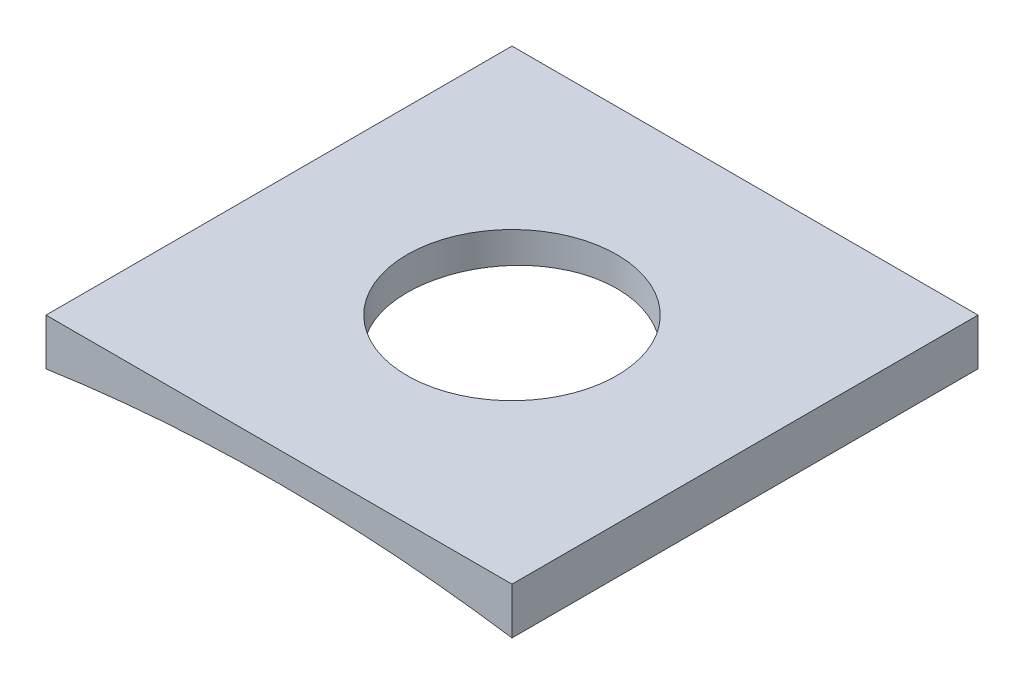
ISO-10303-21;
HEADER;
FILE_DESCRIPTION(('STEP AP214'),'2;1');
FILE_NAME('part.step','',(''),(''),'','','');
FILE_SCHEMA(('AUTOMOTIVE_DESIGN { 1 0 10303 214 1 1 1 1 }'));
ENDSEC;
DATA;
#1=APPLICATION_CONTEXT('core data for automotive mechanical design processes');
#2=APPLICATION_PROTOCOL_DEFINITION('international standard','automotive_design',2000,#1);
#3=PRODUCT_CONTEXT('',#1,'mechanical');
#4=PRODUCT('Part','Part','',(#3));
#5=PRODUCT_RELATED_PRODUCT_CATEGORY('part','',(#4));
#6=PRODUCT_DEFINITION_FORMATION('','',#4);
#7=PRODUCT_DEFINITION_CONTEXT('part definition',#1,'design');
#8=PRODUCT_DEFINITION('design','',#6,#7);
#9=PRODUCT_DEFINITION_SHAPE('','',#8);
#10=(LENGTH_UNIT() NAMED_UNIT(*) SI_UNIT(.MILLI.,.METRE.));
#11=(NAMED_UNIT(*) PLANE_ANGLE_UNIT() SI_UNIT($,.RADIAN.));
#12=(NAMED_UNIT(*) SI_UNIT($,.STERADIAN.) SOLID_ANGLE_UNIT());
#13=UNCERTAINTY_MEASURE_WITH_UNIT(LENGTH_MEASURE(1.E-05),#10,'distance_accuracy_value','');
#14=(GEOMETRIC_REPRESENTATION_CONTEXT(3) GLOBAL_UNCERTAINTY_ASSIGNED_CONTEXT((#13)) GLOBAL_UNIT_ASSIGNED_CONTEXT((#10,
#11,#12)) REPRESENTATION_CONTEXT('',''));
#15=CARTESIAN_POINT('',(0.,0.,0.));
#16=DIRECTION('',(0.,0.,1.));
#17=DIRECTION('',(1.,0.,0.));
#18=AXIS2_PLACEMENT_3D('',#15,#16,#17);
#19=CARTESIAN_POINT('',(-5.,0.,5.));
#20=DIRECTION('',(1.,0.,0.));
#21=DIRECTION('',(0.,0.,-1.));
#22=AXIS2_PLACEMENT_3D('',#19,#20,#21);
#23=PLANE('',#22);
#24=DIRECTION('',(0.,-1.,0.));
#25=VECTOR('',#24,1.);
#26=CARTESIAN_POINT('',(-5.,0.,-5.));
#27=LINE('',#26,#25);
#28=CARTESIAN_POINT('',(-5.,0.,-5.));
#29=VERTEX_POINT('',#28);
#30=CARTESIAN_POINT('',(-5.,-1.,-5.));
#31=VERTEX_POINT('',#30);
#32=EDGE_CURVE('E102',#29,#31,#27,.T.);
#33=ORIENTED_EDGE('',*,*,#32,.T.);
#34=DIRECTION('',(0.,0.,-1.));
#35=VECTOR('',#34,1.);
#36=CARTESIAN_POINT('',(-5.,-1.,5.));
#37=LINE('',#36,#35);
#38=CARTESIAN_POINT('',(-5.,-1.,5.));
#39=VERTEX_POINT('',#38);
#40=EDGE_CURVE('E11',#39,#31,#37,.T.);
#41=ORIENTED_EDGE('',*,*,#40,.F.);
#42=DIRECTION('',(0.,-1.,0.));
#43=VECTOR('',#42,1.);
#44=CARTESIAN_POINT('',(-5.,0.,5.));
#45=LINE('',#44,#43);
#46=CARTESIAN_POINT('',(-5.,0.,5.));
#47=VERTEX_POINT('',#46);
#48=EDGE_CURVE('E90',#47,#39,#45,.T.);
#49=ORIENTED_EDGE('',*,*,#48,.F.);
#50=DIRECTION('',(0.,0.,-1.));
#51=VECTOR('',#50,1.);
#52=CARTESIAN_POINT('',(-5.,0.,5.));
#53=LINE('',#52,#51);
#54=EDGE_CURVE('E98',#47,#29,#53,.T.);
#55=ORIENTED_EDGE('',*,*,#54,.T.);
#56=EDGE_LOOP('',(#33,#41,#49,#55));
#57=FACE_BOUND('',#56,.T.);
#58=ADVANCED_FACE('F39',(#57),#23,.F.);
#59=CARTESIAN_POINT('',(0.,-34.7314393407693,5.));
#60=DIRECTION('',(0.,0.,-1.));
#61=DIRECTION('',(-1.,0.,0.));
#62=AXIS2_PLACEMENT_3D('',#59,#60,#61);
#63=CYLINDRICAL_SURFACE('',#62,34.1);
#64=CARTESIAN_POINT('',(-2.25,-0.70575051600047,0.));
#65=CARTESIAN_POINT('',(-2.24999445092166,-0.705749523236923,0.126235808529473));
#66=CARTESIAN_POINT('',(-2.23934064078078,-0.70504045504955,0.252559647037371));
#67=CARTESIAN_POINT('',(-2.19699399993807,-0.702280517595857,0.501718164025917));
#68=CARTESIAN_POINT('',(-2.16527677634141,-0.700228092668979,0.624548624745593));
#69=CARTESIAN_POINT('',(-2.08171923163651,-0.695014924637333,0.863075292777723));
#70=CARTESIAN_POINT('',(-2.02988964832881,-0.691854773024369,0.978775268856988));
#71=CARTESIAN_POINT('',(-1.90759627446108,-0.684782973813485,1.19980330612036));
#72=CARTESIAN_POINT('',(-1.83713670897277,-0.680871496662748,1.30513371158363));
#73=CARTESIAN_POINT('',(-1.67945564146109,-0.672730443744973,1.50263733898752));
#74=CARTESIAN_POINT('',(-1.592209725388,-0.668500410191033,1.59479105224284));
#75=CARTESIAN_POINT('',(-1.40348319242217,-0.660203117057835,1.76315831340248));
#76=CARTESIAN_POINT('',(-1.30200197800896,-0.656135864320446,1.83937119186252));
#77=CARTESIAN_POINT('',(-1.08757449598599,-0.648618398681914,1.97375407320149));
#78=CARTESIAN_POINT('',(-0.974618026659498,-0.645168742494709,2.03190783156152));
#79=CARTESIAN_POINT('',(-0.740517944198761,-0.63928000255331,2.12841770876315));
#80=CARTESIAN_POINT('',(-0.619374426897211,-0.636840906972478,2.166774059296));
#81=CARTESIAN_POINT('',(-0.372527901487626,-0.633251280482183,2.22254591145583));
#82=CARTESIAN_POINT('',(-0.246831857210144,-0.632098860757554,2.23999211155179));
#83=CARTESIAN_POINT('',(0.00570949114666901,-0.631206068412791,2.25354324544634));
#84=CARTESIAN_POINT('',(0.132554781010568,-0.631465678350497,2.24964844286062));
#85=CARTESIAN_POINT('',(0.383585983036591,-0.633366119614379,2.22065342047956));
#86=CARTESIAN_POINT('',(0.507775727740445,-0.635004800118609,2.19558622129395));
#87=CARTESIAN_POINT('',(0.75018093200988,-0.639476444288387,2.12500922866355));
#88=CARTESIAN_POINT('',(0.868396353027234,-0.642309415658777,2.07949930333455));
#89=CARTESIAN_POINT('',(1.09560307101562,-0.648854410716178,1.96929141394182));
#90=CARTESIAN_POINT('',(1.20458710155329,-0.652567118312002,1.90457851151719));
#91=CARTESIAN_POINT('',(1.41015803407347,-0.660453838622589,1.7578124937862));
#92=CARTESIAN_POINT('',(1.50674478001006,-0.66462785714269,1.67575916024842));
#93=CARTESIAN_POINT('',(1.68497217901161,-0.672976931699464,1.49645503655897));
#94=CARTESIAN_POINT('',(1.76658399687773,-0.677151974552972,1.39917558099687));
#95=CARTESIAN_POINT('',(1.9123224901094,-0.685024456013157,1.19228097082956));
#96=CARTESIAN_POINT('',(1.97644915763091,-0.688721894405576,1.08266581069044));
#97=CARTESIAN_POINT('',(2.08539511626225,-0.695221564138865,0.854192752724142));
#98=CARTESIAN_POINT('',(2.13021315134898,-0.698023737239826,0.735334254212972));
#99=CARTESIAN_POINT('',(2.19924950546209,-0.702414838707556,0.491757064023381));
#100=CARTESIAN_POINT('',(2.22346809474521,-0.704003782991389,0.36703844925007));
#101=CARTESIAN_POINT('',(2.25058207028403,-0.705786246329163,0.115532972601835));
#102=CARTESIAN_POINT('',(2.25351755790355,-0.705982389667494,-0.011249548289347));
#103=CARTESIAN_POINT('',(2.23808681756851,-0.704963988953919,-0.263505131819853));
#104=CARTESIAN_POINT('',(2.21972071334229,-0.703749453095815,-0.38897820206073));
#105=CARTESIAN_POINT('',(2.16224146487577,-0.70004895633379,-0.634939509833964));
#106=CARTESIAN_POINT('',(2.12314682558515,-0.697564129525308,-0.755432090331429));
#107=CARTESIAN_POINT('',(2.02533901394418,-0.691604022474479,-0.988146195617621));
#108=CARTESIAN_POINT('',(1.96662564332686,-0.688128732222557,-1.1003676368042));
#109=CARTESIAN_POINT('',(1.83114469829858,-0.680572956048761,-1.3135380092104));
#110=CARTESIAN_POINT('',(1.75435027551126,-0.676491573507069,-1.41446984463258));
#111=CARTESIAN_POINT('',(1.58492616945375,-0.668186655905133,-1.60202362032119));
#112=CARTESIAN_POINT('',(1.49229631392603,-0.663963119298942,-1.68864540490302));
#113=CARTESIAN_POINT('',(1.29365806977257,-0.655842120127604,-1.84525586836527));
#114=CARTESIAN_POINT('',(1.18762918552208,-0.651945172643479,-1.91521858178234));
#115=CARTESIAN_POINT('',(0.965305582431856,-0.644923856792344,-2.03634716927624));
#116=CARTESIAN_POINT('',(0.849010932786488,-0.641799483218491,-2.08751317003663));
#117=CARTESIAN_POINT('',(0.609552078767748,-0.636677800566929,-2.16955083606715));
#118=CARTESIAN_POINT('',(0.486393505554243,-0.634679582124016,-2.2004388790299));
#119=CARTESIAN_POINT('',(0.236624690888765,-0.63203172405215,-2.24109741910184));
#120=CARTESIAN_POINT('',(0.11001448802563,-0.631382069352664,-2.25086815220225));
#121=CARTESIAN_POINT('',(-0.14280674630503,-0.63150449545637,-2.24901237115753));
#122=CARTESIAN_POINT('',(-0.269018079172496,-0.632273877950729,-2.23742646682708));
#123=CARTESIAN_POINT('',(-0.517699037151604,-0.635142519213111,-2.19327056398908));
#124=CARTESIAN_POINT('',(-0.640168655864106,-0.637241780255379,-2.16070052959625));
#125=CARTESIAN_POINT('',(-0.877895269118178,-0.642534288397208,-2.07551026776275));
#126=CARTESIAN_POINT('',(-0.99315235687579,-0.645727521354624,-2.02289029951335));
#127=CARTESIAN_POINT('',(-1.21320158331353,-0.652849635867249,-1.89909928367226));
#128=CARTESIAN_POINT('',(-1.31799397761175,-0.656778499446673,-1.82792868936481));
#129=CARTESIAN_POINT('',(-1.51434555735581,-0.664938958828462,-1.66890599529109));
#130=CARTESIAN_POINT('',(-1.60588081559972,-0.669171081896176,-1.58102437956832));
#131=CARTESIAN_POINT('',(-1.77293199491233,-0.67745679263509,-1.39111693458114));
#132=CARTESIAN_POINT('',(-1.84844399640658,-0.681510336430906,-1.2890876546148));
#133=CARTESIAN_POINT('',(-1.98136773952898,-0.68898593624572,-1.0736527275678));
#134=CARTESIAN_POINT('',(-2.03875523259294,-0.692407143754127,-0.960232105129166));
#135=CARTESIAN_POINT('',(-2.13360162658573,-0.698219934644988,-0.72542453309305));
#136=CARTESIAN_POINT('',(-2.17108380552662,-0.700612720074883,-0.6040470760436));
#137=CARTESIAN_POINT('',(-2.21534229660053,-0.70347236745179,-0.401609010315515));
#138=CARTESIAN_POINT('',(-2.22832206042531,-0.70432283956223,-0.321856062430547));
#139=CARTESIAN_POINT('',(-2.24565267960683,-0.705462230820927,-0.161414074816145));
#140=CARTESIAN_POINT('',(-2.25000354851414,-0.705751150851028,-0.0807250365569201));
#141=CARTESIAN_POINT('',(-2.25,-0.70575051600047,0.));
#142=B_SPLINE_CURVE_WITH_KNOTS('',3,(#64,#65,#66,#67,#68,#69,#70,#71,#72,#73,#74,#75,#76,#77,
#78,#79,#80,#81,#82,#83,#84,#85,#86,#87,#88,#89,#90,#91,#92,#93,#94,#95,#96,#97,#98,#99,#100,
#101,#102,#103,#104,#105,#106,#107,#108,#109,#110,#111,#112,#113,#114,#115,#116,#117,#118,#119,
#120,#121,#122,#123,#124,#125,#126,#127,#128,#129,#130,#131,#132,#133,#134,#135,#136,#137,#138,
#139,#140,#141),.UNSPECIFIED.,.T.,.F.,(4,2,2,2,2,2,2,2,2,2,2,2,2,2,2,2,2,2,2,2,2,2,2,2,2,2,2,2,
2,2,2,2,2,2,2,2,2,2,4),(0.,0.378412722404043,0.757264438981981,1.13591416784424,
1.51447809672701,1.8935968283583,2.27273147809793,2.65220618529815,3.0316764513632,
3.4105889270127,3.78949672213945,4.16781465902857,4.54613503663324,4.92475049184193,
5.30337071225579,5.68271251017288,6.06205447826665,6.44142111876335,6.82078278203997,
7.19942947043406,7.57807395950446,7.95638098966257,8.33469184310841,8.71356802937063,
9.09244833730275,9.47191537261753,9.85137985040465,10.2305374716802,10.6096908557524,
10.9881240202687,11.3665578319514,11.7449867516771,12.1234064253651,12.5025008003671,
12.881687801985,13.2613799851713,13.6406271589789,13.882614192423,14.1246008458577),.UNSPECIFIED.);
#143=CARTESIAN_POINT('',(-2.25,-0.70575051600047,0.));
#144=VERTEX_POINT('',#143);
#145=EDGE_CURVE('E105',#144,#144,#142,.T.);
#146=ORIENTED_EDGE('',*,*,#145,.T.);
#147=EDGE_LOOP('',(#146));
#148=FACE_BOUND('',#147,.T.);
#149=CARTESIAN_POINT('',(0.,-34.7314393407693,-5.));
#150=DIRECTION('',(0.,0.,-1.));
#151=DIRECTION('',(-1.,0.,0.));
#152=AXIS2_PLACEMENT_3D('',#149,#150,#151);
#153=CIRCLE('',#152,34.1);
#154=CARTESIAN_POINT('',(5.,-1.,-5.));
#155=VERTEX_POINT('',#154);
#156=EDGE_CURVE('E94',#31,#155,#153,.T.);
#157=ORIENTED_EDGE('',*,*,#156,.T.);
#158=DIRECTION('',(0.,0.,-1.));
#159=VECTOR('',#158,1.);
#160=CARTESIAN_POINT('',(5.,-1.,5.));
#161=LINE('',#160,#159);
#162=CARTESIAN_POINT('',(5.,-1.,5.));
#163=VERTEX_POINT('',#162);
#164=EDGE_CURVE('E47',#163,#155,#161,.T.);
#165=ORIENTED_EDGE('',*,*,#164,.F.);
#166=CARTESIAN_POINT('',(0.,-34.7314393407693,5.));
#167=DIRECTION('',(0.,0.,-1.));
#168=DIRECTION('',(-1.,0.,0.));
#169=AXIS2_PLACEMENT_3D('',#166,#167,#168);
#170=CIRCLE('',#169,34.1);
#171=EDGE_CURVE('E85',#39,#163,#170,.T.);
#172=ORIENTED_EDGE('',*,*,#171,.F.);
#173=ORIENTED_EDGE('',*,*,#40,.T.);
#174=EDGE_LOOP('',(#157,#165,#172,#173));
#175=FACE_BOUND('',#174,.T.);
#176=ADVANCED_FACE('F93',(#148,#175),#63,.F.);
#177=CARTESIAN_POINT('',(5.,0.,5.));
#178=DIRECTION('',(-1.,0.,0.));
#179=DIRECTION('',(0.,0.,1.));
#180=AXIS2_PLACEMENT_3D('',#177,#178,#179);
#181=PLANE('',#180);
#182=DIRECTION('',(0.,1.,0.));
#183=VECTOR('',#182,1.);
#184=CARTESIAN_POINT('',(5.,0.,-5.));
#185=LINE('',#184,#183);
#186=CARTESIAN_POINT('',(5.,0.,-5.));
#187=VERTEX_POINT('',#186);
#188=EDGE_CURVE('E72',#155,#187,#185,.T.);
#189=ORIENTED_EDGE('',*,*,#188,.T.);
#190=DIRECTION('',(0.,0.,-1.));
#191=VECTOR('',#190,1.);
#192=CARTESIAN_POINT('',(5.,0.,5.));
#193=LINE('',#192,#191);
#194=CARTESIAN_POINT('',(5.,0.,5.));
#195=VERTEX_POINT('',#194);
#196=EDGE_CURVE('E95',#195,#187,#193,.T.);
#197=ORIENTED_EDGE('',*,*,#196,.F.);
#198=DIRECTION('',(0.,1.,0.));
#199=VECTOR('',#198,1.);
#200=CARTESIAN_POINT('',(5.,0.,5.));
#201=LINE('',#200,#199);
#202=EDGE_CURVE('E88',#163,#195,#201,.T.);
#203=ORIENTED_EDGE('',*,*,#202,.F.);
#204=ORIENTED_EDGE('',*,*,#164,.T.);
#205=EDGE_LOOP('',(#189,#197,#203,#204));
#206=FACE_BOUND('',#205,.T.);
#207=ADVANCED_FACE('F96',(#206),#181,.F.);
#208=CARTESIAN_POINT('',(-5.,0.,5.));
#209=DIRECTION('',(0.,-1.,0.));
#210=DIRECTION('',(1.,0.,0.));
#211=AXIS2_PLACEMENT_3D('',#208,#209,#210);
#212=PLANE('',#211);
#213=CARTESIAN_POINT('',(0.,0.,0.));
#214=DIRECTION('',(0.,1.,0.));
#215=DIRECTION('',(-1.,0.,0.));
#216=AXIS2_PLACEMENT_3D('',#213,#214,#215);
#217=CIRCLE('',#216,2.25);
#218=CARTESIAN_POINT('',(-2.25,0.,0.));
#219=VERTEX_POINT('',#218);
#220=EDGE_CURVE('E122',#219,#219,#217,.T.);
#221=ORIENTED_EDGE('',*,*,#220,.F.);
#222=EDGE_LOOP('',(#221));
#223=FACE_BOUND('',#222,.T.);
#224=DIRECTION('',(-1.,0.,0.));
#225=VECTOR('',#224,1.);
#226=CARTESIAN_POINT('',(-5.,0.,-5.));
#227=LINE('',#226,#225);
#228=EDGE_CURVE('E78',#187,#29,#227,.T.);
#229=ORIENTED_EDGE('',*,*,#228,.T.);
#230=ORIENTED_EDGE('',*,*,#54,.F.);
#231=DIRECTION('',(-1.,0.,0.));
#232=VECTOR('',#231,1.);
#233=CARTESIAN_POINT('',(-5.,0.,5.));
#234=LINE('',#233,#232);
#235=EDGE_CURVE('E55',#195,#47,#234,.T.);
#236=ORIENTED_EDGE('',*,*,#235,.F.);
#237=ORIENTED_EDGE('',*,*,#196,.T.);
#238=EDGE_LOOP('',(#229,#230,#236,#237));
#239=FACE_BOUND('',#238,.T.);
#240=ADVANCED_FACE('F110',(#223,#239),#212,.F.);
#241=CARTESIAN_POINT('',(0.,-34.7314393407693,5.));
#242=DIRECTION('',(0.,0.,-1.));
#243=DIRECTION('',(-1.,0.,0.));
#244=AXIS2_PLACEMENT_3D('',#241,#242,#243);
#245=PLANE('',#244);
#246=ORIENTED_EDGE('',*,*,#48,.T.);
#247=ORIENTED_EDGE('',*,*,#171,.T.);
#248=ORIENTED_EDGE('',*,*,#202,.T.);
#249=ORIENTED_EDGE('',*,*,#235,.T.);
#250=EDGE_LOOP('',(#246,#247,#248,#249));
#251=FACE_BOUND('',#250,.T.);
#252=ADVANCED_FACE('F86',(#251),#245,.F.);
#253=CARTESIAN_POINT('',(0.,-34.7314393407693,-5.));
#254=DIRECTION('',(0.,0.,-1.));
#255=DIRECTION('',(-1.,0.,0.));
#256=AXIS2_PLACEMENT_3D('',#253,#254,#255);
#257=PLANE('',#256);
#258=ORIENTED_EDGE('',*,*,#32,.F.);
#259=ORIENTED_EDGE('',*,*,#228,.F.);
#260=ORIENTED_EDGE('',*,*,#188,.F.);
#261=ORIENTED_EDGE('',*,*,#156,.F.);
#262=EDGE_LOOP('',(#258,#259,#260,#261));
#263=FACE_BOUND('',#262,.T.);
#264=ADVANCED_FACE('F113',(#263),#257,.T.);
#265=CARTESIAN_POINT('',(0.,-1.,0.));
#266=DIRECTION('',(0.,1.,0.));
#267=DIRECTION('',(-1.,0.,0.));
#268=AXIS2_PLACEMENT_3D('',#265,#266,#267);
#269=CYLINDRICAL_SURFACE('',#268,2.25);
#270=ORIENTED_EDGE('',*,*,#220,.T.);
#271=EDGE_LOOP('',(#270));
#272=FACE_BOUND('',#271,.T.);
#273=ORIENTED_EDGE('',*,*,#145,.F.);
#274=EDGE_LOOP('',(#273));
#275=FACE_BOUND('',#274,.T.);
#276=ADVANCED_FACE('F125',(#272,#275),#269,.F.);
#277=CLOSED_SHELL('',(#58,#176,#207,#240,#252,#264,#276));
#278=MANIFOLD_SOLID_BREP('B2',#277);
#279=ADVANCED_BREP_SHAPE_REPRESENTATION('',(#18,#278),#14);
#280=SHAPE_DEFINITION_REPRESENTATION(#9,#279);
ENDSEC;
END-ISO-10303-21;
